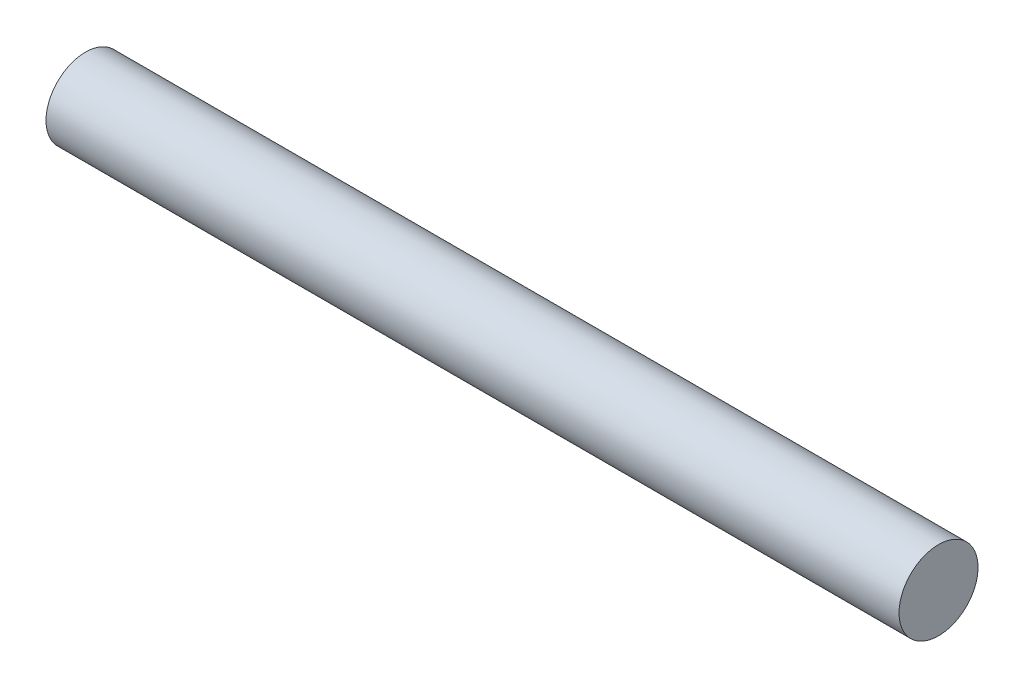
ISO-10303-21;
HEADER;
FILE_DESCRIPTION(('STEP AP214'),'2;1');
FILE_NAME('part.step','',(''),(''),'','','');
FILE_SCHEMA(('AUTOMOTIVE_DESIGN { 1 0 10303 214 1 1 1 1 }'));
ENDSEC;
DATA;
#1=APPLICATION_CONTEXT('core data for automotive mechanical design processes');
#2=APPLICATION_PROTOCOL_DEFINITION('international standard','automotive_design',2000,#1);
#3=PRODUCT_CONTEXT('',#1,'mechanical');
#4=PRODUCT('Part','Part','',(#3));
#5=PRODUCT_RELATED_PRODUCT_CATEGORY('part','',(#4));
#6=PRODUCT_DEFINITION_FORMATION('','',#4);
#7=PRODUCT_DEFINITION_CONTEXT('part definition',#1,'design');
#8=PRODUCT_DEFINITION('design','',#6,#7);
#9=PRODUCT_DEFINITION_SHAPE('','',#8);
#10=(LENGTH_UNIT() NAMED_UNIT(*) SI_UNIT(.MILLI.,.METRE.));
#11=(NAMED_UNIT(*) PLANE_ANGLE_UNIT() SI_UNIT($,.RADIAN.));
#12=(NAMED_UNIT(*) SI_UNIT($,.STERADIAN.) SOLID_ANGLE_UNIT());
#13=UNCERTAINTY_MEASURE_WITH_UNIT(LENGTH_MEASURE(1.E-05),#10,'distance_accuracy_value','');
#14=(GEOMETRIC_REPRESENTATION_CONTEXT(3) GLOBAL_UNCERTAINTY_ASSIGNED_CONTEXT((#13)) GLOBAL_UNIT_ASSIGNED_CONTEXT((#10,
#11,#12)) REPRESENTATION_CONTEXT('',''));
#15=CARTESIAN_POINT('',(0.,0.,0.));
#16=DIRECTION('',(0.,0.,1.));
#17=DIRECTION('',(1.,0.,0.));
#18=AXIS2_PLACEMENT_3D('',#15,#16,#17);
#19=CARTESIAN_POINT('',(20.,0.,0.));
#20=DIRECTION('',(-1.,0.,0.));
#21=DIRECTION('',(0.,0.,1.));
#22=AXIS2_PLACEMENT_3D('',#19,#20,#21);
#23=CONICAL_SURFACE('',#22,3.,0.710262724159754);
#24=CARTESIAN_POINT('',(23.4884305427839,0.,0.));
#25=VERTEX_POINT('',#24);
#26=VERTEX_LOOP('',#25);
#27=FACE_BOUND('',#26,.T.);
#28=CARTESIAN_POINT('',(20.,0.,0.));
#29=DIRECTION('',(-1.,0.,0.));
#30=DIRECTION('',(0.,0.,1.));
#31=AXIS2_PLACEMENT_3D('',#28,#29,#30);
#32=CIRCLE('',#31,3.);
#33=CARTESIAN_POINT('',(20.,0.,3.));
#34=VERTEX_POINT('',#33);
#35=EDGE_CURVE('E11',#34,#34,#32,.T.);
#36=ORIENTED_EDGE('',*,*,#35,.T.);
#37=EDGE_LOOP('',(#36));
#38=FACE_BOUND('',#37,.T.);
#39=ADVANCED_FACE('F33',(#27,#38),#23,.F.);
#40=CARTESIAN_POINT('',(-33.9877744878666,0.,0.));
#41=DIRECTION('',(-1.,0.,0.));
#42=DIRECTION('',(0.,0.,1.));
#43=AXIS2_PLACEMENT_3D('',#40,#41,#42);
#44=CYLINDRICAL_SURFACE('',#43,3.);
#45=ORIENTED_EDGE('',*,*,#35,.F.);
#46=EDGE_LOOP('',(#45));
#47=FACE_BOUND('',#46,.T.);
#48=CARTESIAN_POINT('',(3.44165984743016,0.,0.));
#49=DIRECTION('',(-1.,0.,0.));
#50=DIRECTION('',(0.,0.,1.));
#51=AXIS2_PLACEMENT_3D('',#48,#49,#50);
#52=CIRCLE('',#51,3.);
#53=CARTESIAN_POINT('',(3.44165984743016,0.,3.));
#54=VERTEX_POINT('',#53);
#55=EDGE_CURVE('E39',#54,#54,#52,.T.);
#56=ORIENTED_EDGE('',*,*,#55,.T.);
#57=EDGE_LOOP('',(#56));
#58=FACE_BOUND('',#57,.T.);
#59=ADVANCED_FACE('F44',(#47,#58),#44,.F.);
#60=CARTESIAN_POINT('',(1.69744457603822,0.,0.));
#61=DIRECTION('',(-1.,0.,0.));
#62=DIRECTION('',(0.,0.,1.));
#63=AXIS2_PLACEMENT_3D('',#60,#61,#62);
#64=CONICAL_SURFACE('',#63,4.5,0.710262724159758);
#65=ORIENTED_EDGE('',*,*,#55,.F.);
#66=EDGE_LOOP('',(#65));
#67=FACE_BOUND('',#66,.T.);
#68=CARTESIAN_POINT('',(1.69744457603822,0.,0.));
#69=DIRECTION('',(-1.,0.,0.));
#70=DIRECTION('',(0.,0.,1.));
#71=AXIS2_PLACEMENT_3D('',#68,#69,#70);
#72=CIRCLE('',#71,4.5);
#73=CARTESIAN_POINT('',(1.69744457603822,0.,4.5));
#74=VERTEX_POINT('',#73);
#75=EDGE_CURVE('E53',#74,#74,#72,.T.);
#76=ORIENTED_EDGE('',*,*,#75,.T.);
#77=EDGE_LOOP('',(#76));
#78=FACE_BOUND('',#77,.T.);
#79=ADVANCED_FACE('F49',(#67,#78),#64,.F.);
#80=CARTESIAN_POINT('',(-33.9877744878666,0.,0.));
#81=DIRECTION('',(-1.,0.,0.));
#82=DIRECTION('',(0.,0.,1.));
#83=AXIS2_PLACEMENT_3D('',#80,#81,#82);
#84=CYLINDRICAL_SURFACE('',#83,4.5);
#85=ORIENTED_EDGE('',*,*,#75,.F.);
#86=EDGE_LOOP('',(#85));
#87=FACE_BOUND('',#86,.T.);
#88=CARTESIAN_POINT('',(0.,0.,0.));
#89=DIRECTION('',(-1.,0.,0.));
#90=DIRECTION('',(0.,0.,1.));
#91=AXIS2_PLACEMENT_3D('',#88,#89,#90);
#92=CIRCLE('',#91,4.5);
#93=CARTESIAN_POINT('',(0.,0.,4.5));
#94=VERTEX_POINT('',#93);
#95=EDGE_CURVE('E55',#94,#94,#92,.T.);
#96=ORIENTED_EDGE('',*,*,#95,.T.);
#97=EDGE_LOOP('',(#96));
#98=FACE_BOUND('',#97,.T.);
#99=ADVANCED_FACE('F81',(#87,#98),#84,.F.);
#100=CARTESIAN_POINT('',(0.,0.,-4.5));
#101=DIRECTION('',(1.,0.,0.));
#102=DIRECTION('',(0.,0.,-1.));
#103=AXIS2_PLACEMENT_3D('',#100,#101,#102);
#104=PLANE('',#103);
#105=ORIENTED_EDGE('',*,*,#95,.F.);
#106=EDGE_LOOP('',(#105));
#107=FACE_BOUND('',#106,.T.);
#108=CARTESIAN_POINT('',(0.,0.,0.));
#109=DIRECTION('',(-1.,0.,0.));
#110=DIRECTION('',(0.,0.,1.));
#111=AXIS2_PLACEMENT_3D('',#108,#109,#110);
#112=CIRCLE('',#111,5.25);
#113=CARTESIAN_POINT('',(0.,0.,5.25));
#114=VERTEX_POINT('',#113);
#115=EDGE_CURVE('E60',#114,#114,#112,.T.);
#116=ORIENTED_EDGE('',*,*,#115,.T.);
#117=EDGE_LOOP('',(#116));
#118=FACE_BOUND('',#117,.T.);
#119=ADVANCED_FACE('F75',(#107,#118),#104,.F.);
#120=CARTESIAN_POINT('',(-33.9877744878666,0.,0.));
#121=DIRECTION('',(-1.,0.,0.));
#122=DIRECTION('',(0.,0.,1.));
#123=AXIS2_PLACEMENT_3D('',#120,#121,#122);
#124=CYLINDRICAL_SURFACE('',#123,5.25);
#125=ORIENTED_EDGE('',*,*,#115,.F.);
#126=EDGE_LOOP('',(#125));
#127=FACE_BOUND('',#126,.T.);
#128=CARTESIAN_POINT('',(113.292859098591,0.,0.));
#129=DIRECTION('',(-1.,0.,0.));
#130=DIRECTION('',(0.,0.,1.));
#131=AXIS2_PLACEMENT_3D('',#128,#129,#130);
#132=CIRCLE('',#131,5.25);
#133=CARTESIAN_POINT('',(113.292859098591,0.,5.25));
#134=VERTEX_POINT('',#133);
#135=EDGE_CURVE('E63',#134,#134,#132,.T.);
#136=ORIENTED_EDGE('',*,*,#135,.T.);
#137=EDGE_LOOP('',(#136));
#138=FACE_BOUND('',#137,.T.);
#139=ADVANCED_FACE('F67',(#127,#138),#124,.T.);
#140=CARTESIAN_POINT('',(113.292859098591,0.,-5.25));
#141=DIRECTION('',(-1.,0.,0.));
#142=DIRECTION('',(0.,0.,1.));
#143=AXIS2_PLACEMENT_3D('',#140,#141,#142);
#144=PLANE('',#143);
#145=ORIENTED_EDGE('',*,*,#135,.F.);
#146=EDGE_LOOP('',(#145));
#147=FACE_BOUND('',#146,.T.);
#148=ADVANCED_FACE('F69',(#147),#144,.F.);
#149=CLOSED_SHELL('',(#39,#59,#79,#99,#119,#139,#148));
#150=MANIFOLD_SOLID_BREP('B2',#149);
#151=ADVANCED_BREP_SHAPE_REPRESENTATION('',(#18,#150),#14);
#152=SHAPE_DEFINITION_REPRESENTATION(#9,#151);
ENDSEC;
END-ISO-10303-21;
